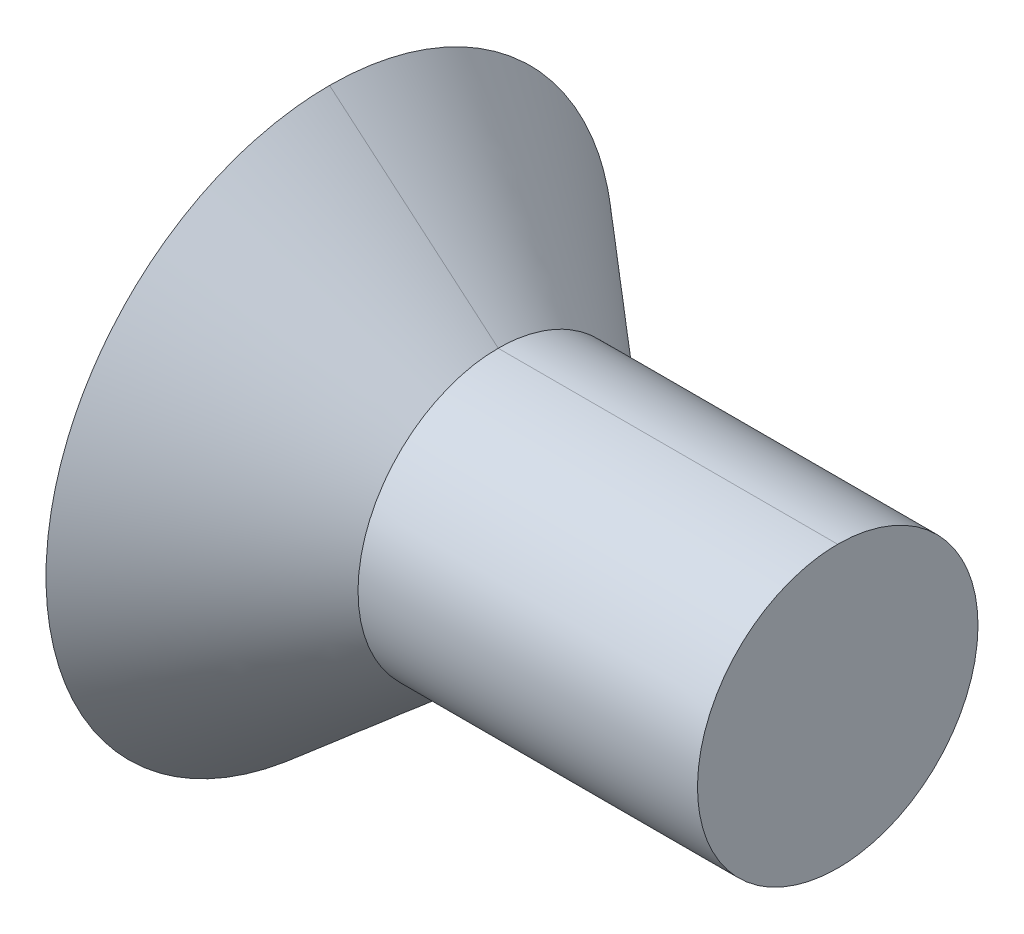
ISO-10303-21;
HEADER;
FILE_DESCRIPTION(('STEP AP214'),'2;1');
FILE_NAME('part.step','',(''),(''),'','','');
FILE_SCHEMA(('AUTOMOTIVE_DESIGN { 1 0 10303 214 1 1 1 1 }'));
ENDSEC;
DATA;
#1=APPLICATION_CONTEXT('core data for automotive mechanical design processes');
#2=APPLICATION_PROTOCOL_DEFINITION('international standard','automotive_design',2000,#1);
#3=PRODUCT_CONTEXT('',#1,'mechanical');
#4=PRODUCT('Part','Part','',(#3));
#5=PRODUCT_RELATED_PRODUCT_CATEGORY('part','',(#4));
#6=PRODUCT_DEFINITION_FORMATION('','',#4);
#7=PRODUCT_DEFINITION_CONTEXT('part definition',#1,'design');
#8=PRODUCT_DEFINITION('design','',#6,#7);
#9=PRODUCT_DEFINITION_SHAPE('','',#8);
#10=(LENGTH_UNIT() NAMED_UNIT(*) SI_UNIT(.MILLI.,.METRE.));
#11=(NAMED_UNIT(*) PLANE_ANGLE_UNIT() SI_UNIT($,.RADIAN.));
#12=(NAMED_UNIT(*) SI_UNIT($,.STERADIAN.) SOLID_ANGLE_UNIT());
#13=UNCERTAINTY_MEASURE_WITH_UNIT(LENGTH_MEASURE(1.E-05),#10,'distance_accuracy_value','');
#14=(GEOMETRIC_REPRESENTATION_CONTEXT(3) GLOBAL_UNCERTAINTY_ASSIGNED_CONTEXT((#13)) GLOBAL_UNIT_ASSIGNED_CONTEXT((#10,
#11,#12)) REPRESENTATION_CONTEXT('',''));
#15=CARTESIAN_POINT('',(0.,0.,0.));
#16=DIRECTION('',(0.,0.,1.));
#17=DIRECTION('',(1.,0.,0.));
#18=AXIS2_PLACEMENT_3D('',#15,#16,#17);
#19=CARTESIAN_POINT('',(0.635,14.4526,34.47415));
#20=CARTESIAN_POINT('',(0.635,14.4539081064262,34.2901004562126));
#21=CARTESIAN_POINT('',(0.635,14.393858912631,33.9238295495636));
#22=CARTESIAN_POINT('',(0.635,14.1415615489514,33.4268467862032));
#23=CARTESIAN_POINT('',(0.635,13.7471939976576,33.0327687066444));
#24=CARTESIAN_POINT('',(0.635,13.2505770594482,32.7796792811504));
#25=CARTESIAN_POINT('',(0.635,12.6999968705676,32.692484266031));
#26=CARTESIAN_POINT('',(0.635,12.1494354583068,32.7796836547764));
#27=CARTESIAN_POINT('',(0.635,11.6527621901618,33.0327512120896));
#28=CARTESIAN_POINT('',(0.635,11.2586011819906,33.426912390771));
#29=CARTESIAN_POINT('',(0.635,11.0055339757836,33.9235846257926));
#30=CARTESIAN_POINT('',(0.635,10.9474000000004,34.290628208596));
#31=CARTESIAN_POINT('',(0.635,10.9473999999998,34.4741499999957));
#32=(BOUNDED_CURVE() B_SPLINE_CURVE(3,(#19,#20,#21,#22,#23,#24,#25,#26,#27,#28,#29,#30,#31),
.UNSPECIFIED.,.F.,.F.) B_SPLINE_CURVE_WITH_KNOTS((4,1,1,1,1,1,1,1,1,1,4),(0.,0.02158795617555,
0.0431759123511,0.06476386852666,0.08635182470221,0.107939780878,0.129527737053,0.151115693229,
0.172703649404,0.19429160558,0.215879561756),
.UNSPECIFIED.) CURVE() GEOMETRIC_REPRESENTATION_ITEM() RATIONAL_B_SPLINE_CURVE((1.,1.,1.,1.,1.,
1.,1.,1.,1.,1.,1.,1.,1.)) REPRESENTATION_ITEM(''));
#33=DIRECTION('',(-1.,0.,0.));
#34=VECTOR('',#33,1.);
#35=SURFACE_OF_LINEAR_EXTRUSION('',#32,#34);
#36=DIRECTION('',(-1.,0.,0.));
#37=VECTOR('',#36,1.);
#38=CARTESIAN_POINT('',(0.635,14.4526,34.47415));
#39=LINE('',#38,#37);
#40=CARTESIAN_POINT('',(4.8768,14.4526,34.47415));
#41=VERTEX_POINT('',#40);
#42=CARTESIAN_POINT('',(0.635,14.4526000000001,34.47415));
#43=VERTEX_POINT('',#42);
#44=EDGE_CURVE('E11',#41,#43,#39,.T.);
#45=ORIENTED_EDGE('',*,*,#44,.F.);
#46=CARTESIAN_POINT('',(4.8768,14.4526,34.47415));
#47=CARTESIAN_POINT('',(4.8768,14.4539081064262,34.2901004562126));
#48=CARTESIAN_POINT('',(4.8768,14.393858912631,33.9238295495636));
#49=CARTESIAN_POINT('',(4.8768,14.1415615489514,33.4268467862032));
#50=CARTESIAN_POINT('',(4.8768,13.7471939976576,33.0327687066444));
#51=CARTESIAN_POINT('',(4.8768,13.2505770594482,32.7796792811504));
#52=CARTESIAN_POINT('',(4.8768,12.6999968705676,32.692484266031));
#53=CARTESIAN_POINT('',(4.8768,12.1494354583068,32.7796836547764));
#54=CARTESIAN_POINT('',(4.8768,11.6527621901618,33.0327512120896));
#55=CARTESIAN_POINT('',(4.8768,11.2586011819906,33.426912390771));
#56=CARTESIAN_POINT('',(4.8768,11.0055339757836,33.9235846257926));
#57=CARTESIAN_POINT('',(4.8768,10.9474000000004,34.290628208596));
#58=CARTESIAN_POINT('',(4.8768,10.9473999999998,34.4741499999957));
#59=(BOUNDED_CURVE() B_SPLINE_CURVE(3,(#46,#47,#48,#49,#50,#51,#52,#53,#54,#55,#56,#57,#58),
.UNSPECIFIED.,.F.,.F.) B_SPLINE_CURVE_WITH_KNOTS((4,1,1,1,1,1,1,1,1,1,4),(0.,0.02158795617555,
0.0431759123511,0.06476386852666,0.08635182470221,0.107939780878,0.129527737053,0.151115693229,
0.172703649404,0.19429160558,0.215879561756),
.UNSPECIFIED.) CURVE() GEOMETRIC_REPRESENTATION_ITEM() RATIONAL_B_SPLINE_CURVE((1.,1.,1.,1.,1.,
1.,1.,1.,1.,1.,1.,1.,1.)) REPRESENTATION_ITEM(''));
#60=CARTESIAN_POINT('',(4.8768,10.9473999999998,34.4741499999957));
#61=VERTEX_POINT('',#60);
#62=EDGE_CURVE('E55',#41,#61,#59,.T.);
#63=ORIENTED_EDGE('',*,*,#62,.T.);
#64=DIRECTION('',(-1.,0.,0.));
#65=VECTOR('',#64,1.);
#66=CARTESIAN_POINT('',(0.635,10.9473999999998,34.4741499999957));
#67=LINE('',#66,#65);
#68=CARTESIAN_POINT('',(0.635,10.9473999999999,34.47415));
#69=VERTEX_POINT('',#68);
#70=EDGE_CURVE('E28',#61,#69,#67,.T.);
#71=ORIENTED_EDGE('',*,*,#70,.T.);
#72=CARTESIAN_POINT('',(0.635,14.4526000000001,34.47415));
#73=CARTESIAN_POINT('',(0.634998647830204,14.4526011485306,34.4757123912241));
#74=CARTESIAN_POINT('',(0.634977245608798,14.4526172208479,34.4772747803708));
#75=CARTESIAN_POINT('',(0.634945375153514,14.4526358662417,34.4803997018677));
#76=CARTESIAN_POINT('',(0.634934907697919,14.4526384383575,34.4819622342202));
#77=CARTESIAN_POINT('',(0.634901211683683,14.452641786966,34.4866498783637));
#78=CARTESIAN_POINT('',(0.634875689664852,14.4526381955611,34.489775001444));
#79=CARTESIAN_POINT('',(0.634803255192437,14.4525986704447,34.4991501378361));
#80=CARTESIAN_POINT('',(0.634760472900199,14.4525339870384,34.5054000682475));
#81=CARTESIAN_POINT('',(0.634678782802885,14.4523341390989,34.5178983861451));
#82=CARTESIAN_POINT('',(0.634639874732716,14.4521989793918,34.5241467737078));
#83=CARTESIAN_POINT('',(0.634567603176656,14.4518568704601,34.5366418188381));
#84=CARTESIAN_POINT('',(0.634534239896032,14.4516499185786,34.5428884763333));
#85=CARTESIAN_POINT('',(0.634441514235924,14.4509224514359,34.5616221469399));
#86=CARTESIAN_POINT('',(0.634389500424585,14.4502952862276,34.5741052551934));
#87=CARTESIAN_POINT('',(0.634303795558303,14.4487585228089,34.5990550581616));
#88=CARTESIAN_POINT('',(0.634270106408036,14.4478488952545,34.6115217510358));
#89=CARTESIAN_POINT('',(0.634193796670611,14.4447003844373,34.6488826443787));
#90=CARTESIAN_POINT('',(0.634175909436104,14.4420416688969,34.6737428711197));
#91=CARTESIAN_POINT('',(0.634190911815507,14.43562483336,34.7233249652448));
#92=CARTESIAN_POINT('',(0.634223812167846,14.4318664809945,34.7480468022588));
#93=CARTESIAN_POINT('',(0.634323257295269,14.4232658843549,34.7973390527865));
#94=CARTESIAN_POINT('',(0.634389851359575,14.4184220579827,34.821909190934));
#95=CARTESIAN_POINT('',(0.634539899592496,14.4076770479317,34.8708125214083));
#96=CARTESIAN_POINT('',(0.634623352076071,14.4017759699344,34.8951457371616));
#97=CARTESIAN_POINT('',(0.634864334479259,14.3825154069536,34.9677519550048));
#98=CARTESIAN_POINT('',(0.635012453277397,14.3676002813175,35.0156219182782));
#99=CARTESIAN_POINT('',(0.63519223427017,14.3338000330269,35.1099187316894));
#100=CARTESIAN_POINT('',(0.635223922461297,14.3149157975864,35.1563459016767));
#101=CARTESIAN_POINT('',(0.635228920001261,14.2733056468743,35.2474362349603));
#102=CARTESIAN_POINT('',(0.635202241733574,14.2505805474537,35.292099770396));
#103=CARTESIAN_POINT('',(0.635125249266712,14.2014264836002,35.3793318548969));
#104=CARTESIAN_POINT('',(0.635074938979293,14.174998132666,35.4219007493956));
#105=CARTESIAN_POINT('',(0.634997393710663,14.1185568389753,35.5045969335802));
#106=CARTESIAN_POINT('',(0.634970159851766,14.088543721956,35.5447241044259));
#107=CARTESIAN_POINT('',(0.634942006202945,14.0255152584444,35.6218207303083));
#108=CARTESIAN_POINT('',(0.634940804442855,13.9925359722908,35.6588196932168));
#109=CARTESIAN_POINT('',(0.634949400013176,13.9235723974578,35.7299009786003));
#110=CARTESIAN_POINT('',(0.634959197283253,13.8875881252625,35.7639833170727));
#111=CARTESIAN_POINT('',(0.634980358106872,13.8128680364238,35.8289860611818));
#112=CARTESIAN_POINT('',(0.634991721649842,13.7741322383534,35.8599064881584));
#113=CARTESIAN_POINT('',(0.635006795753664,13.6941676879951,35.9183352942962));
#114=CARTESIAN_POINT('',(0.635010506333035,13.6529389417403,35.9458436817143));
#115=CARTESIAN_POINT('',(0.635013394019774,13.568549307143,35.9971326430109));
#116=CARTESIAN_POINT('',(0.635012596998174,13.5254008522375,36.0209336862895));
#117=CARTESIAN_POINT('',(0.635009254885298,13.4372645946276,36.0648396357587));
#118=CARTESIAN_POINT('',(0.635006709822723,13.3922768221349,36.0849446026295));
#119=CARTESIAN_POINT('',(0.635002190848982,13.3007612942232,36.1212934539121));
#120=CARTESIAN_POINT('',(0.635000216937016,13.2542335409639,36.1375373437386));
#121=CARTESIAN_POINT('',(0.634997881267378,13.1599866423265,36.1660208356458));
#122=CARTESIAN_POINT('',(0.634997519545037,13.1122674708626,36.1782603499687));
#123=CARTESIAN_POINT('',(0.634997322174616,12.9677091343895,36.2089237289228));
#124=CARTESIAN_POINT('',(0.634998374579792,12.869478662649,36.2212886714747));
#125=CARTESIAN_POINT('',(0.634999814114831,12.7217749341022,36.2273087676636));
#126=CARTESIAN_POINT('',(0.63500027095252,12.6724587684592,36.2272247641043));
#127=CARTESIAN_POINT('',(0.635001168703106,12.5740050471306,36.222889638541));
#128=CARTESIAN_POINT('',(0.635001609615444,12.5248674977756,36.2186383702539));
#129=CARTESIAN_POINT('',(0.635002826641443,12.3782653046964,36.1997229167135));
#130=CARTESIAN_POINT('',(0.635003498033661,12.2815207226066,36.1789005602413));
#131=CARTESIAN_POINT('',(0.634998130429053,12.0929861180148,36.1212292903012));
#132=CARTESIAN_POINT('',(0.634992091391097,12.0011961258843,36.0843802786034));
#133=CARTESIAN_POINT('',(0.634985647225908,11.8250409249626,35.9958615669373));
#134=CARTESIAN_POINT('',(0.634985242577232,11.740676347455,35.944190608445));
#135=CARTESIAN_POINT('',(0.635017997859462,11.5818894457312,35.8273505354968));
#136=CARTESIAN_POINT('',(0.635051154922981,11.5074662727736,35.7621825745525));
#137=CARTESIAN_POINT('',(0.635059313133957,11.3705716917983,35.6203549308651));
#138=CARTESIAN_POINT('',(0.635034325348289,11.3080980118487,35.5436974375558));
#139=CARTESIAN_POINT('',(0.634891424341065,11.1969391993865,35.3808476408653));
#140=CARTESIAN_POINT('',(0.634773465963777,11.1482607828448,35.2946507216857));
#141=CARTESIAN_POINT('',(0.634773306896559,11.0865534113033,35.1602442404775));
#142=CARTESIAN_POINT('',(0.634802816352793,11.0678583800978,35.1145496474626));
#143=CARTESIAN_POINT('',(0.634973524002973,11.0344044831243,35.0217206868342));
#144=CARTESIAN_POINT('',(0.635114733197984,11.0196460052504,34.974586177846));
#145=CARTESIAN_POINT('',(0.635426332230445,10.9941960257318,34.8793417687315));
#146=CARTESIAN_POINT('',(0.635596661710093,10.9834962563405,34.8312340640429));
#147=CARTESIAN_POINT('',(0.63581272707368,10.966167557854,34.7343089674397));
#148=CARTESIAN_POINT('',(0.635858524744146,10.9595366112753,34.685491939548));
#149=CARTESIAN_POINT('',(0.635733626678408,10.9524503135333,34.6095111336219));
#150=CARTESIAN_POINT('',(0.63565096259215,10.9505588519208,34.5824740736502));
#151=CARTESIAN_POINT('',(0.635464877453356,10.9486650189674,34.5418762130295));
#152=CARTESIAN_POINT('',(0.635392502531931,10.9481909679316,34.5283367609741));
#153=CARTESIAN_POINT('',(0.635255105009229,10.9477165821011,34.5080211318033));
#154=CARTESIAN_POINT('',(0.635204493797782,10.9475979019173,34.5012475362047));
#155=CARTESIAN_POINT('',(0.635137982097379,10.9474791823671,34.4910863321458));
#156=CARTESIAN_POINT('',(0.635117378636844,10.947449492637,34.487699040982));
#157=CARTESIAN_POINT('',(0.63504770091951,10.9474099018676,34.480924499457));
#158=CARTESIAN_POINT('',(0.634998627860969,10.9473999999955,34.4775372491));
#159=CARTESIAN_POINT('',(0.635001245435019,10.9474000000037,34.471075529932));
#160=CARTESIAN_POINT('',(0.635044049966237,10.9474081576332,34.4680010608996));
#161=CARTESIAN_POINT('',(0.635106201307541,10.9474407755638,34.461852080648));
#162=CARTESIAN_POINT('',(0.635125547237534,10.9474652364766,34.4587775694315));
#163=CARTESIAN_POINT('',(0.635187467834021,10.9475630562206,34.4495540790546));
#164=CARTESIAN_POINT('',(0.635233924319912,10.947660852056,34.4434053394331));
#165=CARTESIAN_POINT('',(0.635361218169616,10.9480518424998,34.4249604388873));
#166=CARTESIAN_POINT('',(0.635429974512835,10.9484426400273,34.4126661650048));
#167=CARTESIAN_POINT('',(0.635551253361179,10.9494837147075,34.3880868228996));
#168=CARTESIAN_POINT('',(0.635603773576996,10.9501340284227,34.3758017562183));
#169=CARTESIAN_POINT('',(0.635690245300269,10.9516932264456,34.3512483714529));
#170=CARTESIAN_POINT('',(0.635724197108335,10.9526021065668,34.3389800531007));
#171=CARTESIAN_POINT('',(0.635802139278746,10.9557164086863,34.3021956441281));
#172=CARTESIAN_POINT('',(0.635822164605234,10.9583090255318,34.2777111006504));
#173=CARTESIAN_POINT('',(0.635812119869229,10.964519065994,34.228874198912));
#174=CARTESIAN_POINT('',(0.635782051528988,10.9681364543747,34.2045218361357));
#175=CARTESIAN_POINT('',(0.635688229900749,10.9763983021726,34.1559389277787));
#176=CARTESIAN_POINT('',(0.635624406308978,10.9810448933795,34.1317087433933));
#177=CARTESIAN_POINT('',(0.635479193921296,10.991352796458,34.0834668569421));
#178=CARTESIAN_POINT('',(0.635397805002457,10.997014115431,34.0594551564066));
#179=CARTESIAN_POINT('',(0.635159369540537,11.0155120293541,33.9878208657407));
#180=CARTESIAN_POINT('',(0.635007985727527,11.0298658442176,33.9405798743949));
#181=CARTESIAN_POINT('',(0.634819487431246,11.062514285911,33.8475346730425));
#182=CARTESIAN_POINT('',(0.634782270602417,11.0808053674046,33.8017292126357));
#183=CARTESIAN_POINT('',(0.634767564862208,11.1211677328061,33.7118118890514));
#184=CARTESIAN_POINT('',(0.634790080214216,11.1432392864403,33.6677001469912));
#185=CARTESIAN_POINT('',(0.634861684166555,11.1909955299956,33.5815020350176));
#186=CARTESIAN_POINT('',(0.634910758860541,11.2166783238844,33.5394146177237));
#187=CARTESIAN_POINT('',(0.634990418073728,11.2714990913491,33.4575777236255));
#188=CARTESIAN_POINT('',(0.635021003340592,11.3006369251554,33.4178281523436));
#189=CARTESIAN_POINT('',(0.635073321390486,11.3929506608794,33.3024815780204));
#190=CARTESIAN_POINT('',(0.635055739658761,11.4610693961461,33.230709954503));
#191=CARTESIAN_POINT('',(0.635023894276423,11.5713904626161,33.132433774834));
#192=CARTESIAN_POINT('',(0.635012359900441,11.6095423675241,33.1012253745149));
#193=CARTESIAN_POINT('',(0.634995947823556,11.6883695841661,33.0421446014249));
#194=CARTESIAN_POINT('',(0.634991070032477,11.7290448617089,33.0142721834672));
#195=CARTESIAN_POINT('',(0.634986592657636,11.8126006842347,32.9620515746871));
#196=CARTESIAN_POINT('',(0.634986993971428,11.855481602987,32.9377039838683));
#197=CARTESIAN_POINT('',(0.634989810889867,11.9431340369456,32.8926870105669));
#198=CARTESIAN_POINT('',(0.634992226500805,11.9879055580573,32.8720176395745));
#199=CARTESIAN_POINT('',(0.634996845432421,12.079030514135,32.8345197739432));
#200=CARTESIAN_POINT('',(0.634999048751249,12.1253839628796,32.8176913127685));
#201=CARTESIAN_POINT('',(0.635001788677269,12.2193520853508,32.788029117786));
#202=CARTESIAN_POINT('',(0.635002325271793,12.2669667686616,32.7751954143437));
#203=CARTESIAN_POINT('',(0.635002660432274,12.3631126870405,32.7535715153516));
#204=CARTESIAN_POINT('',(0.635002458879718,12.4116440680452,32.7447819693693));
#205=CARTESIAN_POINT('',(0.635001794500805,12.5092714762475,32.7313020949805));
#206=CARTESIAN_POINT('',(0.635001331679049,12.558367493485,32.7266116943769));
#207=CARTESIAN_POINT('',(0.635000401718501,12.6567833972582,32.72139464682));
#208=CARTESIAN_POINT('',(0.634999934579848,12.7061032765347,32.7208678658012));
#209=CARTESIAN_POINT('',(0.634999028158868,12.8045969817254,32.7239919488449));
#210=CARTESIAN_POINT('',(0.634998588877304,12.8537708036077,32.727642927182));
#211=CARTESIAN_POINT('',(0.634997271588534,13.0005719260658,32.7447648908078));
#212=CARTESIAN_POINT('',(0.634996393428812,13.0975592489786,32.7644008328756));
#213=CARTESIAN_POINT('',(0.635001046432603,13.2867851781244,32.8197596847957));
#214=CARTESIAN_POINT('',(0.635006578407099,13.3790231819527,32.8554846298072));
#215=CARTESIAN_POINT('',(0.635014187654277,13.5562482104215,32.9418436923235));
#216=CARTESIAN_POINT('',(0.635016264883614,13.6412351440705,32.9924779968859));
#217=CARTESIAN_POINT('',(0.634986820028034,13.8014286763592,33.1073260194038));
#218=CARTESIAN_POINT('',(0.634955310375733,13.8766388824216,33.1715347055774));
#219=CARTESIAN_POINT('',(0.634938215707811,14.0152758291076,33.3116516786299));
#220=CARTESIAN_POINT('',(0.63495264680963,14.0786984260117,33.3875640626391));
#221=CARTESIAN_POINT('',(0.635088497624349,14.1918081928493,33.5491825655317));
#222=CARTESIAN_POINT('',(0.635210027852696,14.2414811049036,33.6348987213842));
#223=CARTESIAN_POINT('',(0.635233575815951,14.3048090224289,33.7685947546268));
#224=CARTESIAN_POINT('',(0.635214957936428,14.3240560492103,33.8140182869817));
#225=CARTESIAN_POINT('',(0.63507253644871,14.3587301320535,33.9063226031081));
#226=CARTESIAN_POINT('',(0.634948721705494,14.3741567835076,33.9532035406388));
#227=CARTESIAN_POINT('',(0.634647330147329,14.4009944122102,34.0479649269358));
#228=CARTESIAN_POINT('',(0.634469893443226,14.4124156892131,34.0958424716519));
#229=CARTESIAN_POINT('',(0.634221749977029,14.4311204665626,34.1923880454989));
#230=CARTESIAN_POINT('',(0.63415098735865,14.4384061311362,34.2410556474394));
#231=CARTESIAN_POINT('',(0.634208244318208,14.4451503702047,34.3052263153184));
#232=CARTESIAN_POINT('',(0.63423309210184,14.4465474146932,34.3205417641842));
#233=CARTESIAN_POINT('',(0.634308203235675,14.4489167644309,34.3512019607713));
#234=CARTESIAN_POINT('',(0.634358459330168,14.4498891907881,34.366546698883));
#235=CARTESIAN_POINT('',(0.63448955137352,14.4514037042767,34.3972609560739));
#236=CARTESIAN_POINT('',(0.634570394740854,14.4519456869116,34.4126304802634));
#237=CARTESIAN_POINT('',(0.634711142745853,14.4524373452192,34.4356935676659));
#238=CARTESIAN_POINT('',(0.634761315948971,14.4525476702608,34.4433840199335));
#239=CARTESIAN_POINT('',(0.634848843685057,14.4526263294359,34.4549206343055));
#240=CARTESIAN_POINT('',(0.634880066331678,14.4526380759999,34.4587665425152));
#241=CARTESIAN_POINT('',(0.634919965721929,14.4526424592971,34.4645354447192));
#242=CARTESIAN_POINT('',(0.634932109875762,14.4526417142026,34.4664584454449));
#243=CARTESIAN_POINT('',(0.634972959544703,14.4526197772252,34.4703042984945));
#244=CARTESIAN_POINT('',(0.635001664127744,14.452598586493,34.4722271508206));
#245=CARTESIAN_POINT('',(0.635,14.4526000000001,34.47415));
#246=B_SPLINE_CURVE_WITH_KNOTS('',3,(#72,#73,#74,#75,#76,#77,#78,#79,#80,#81,#82,#83,#84,#85,
#86,#87,#88,#89,#90,#91,#92,#93,#94,#95,#96,#97,#98,#99,#100,#101,#102,#103,#104,#105,#106,#107,
#108,#109,#110,#111,#112,#113,#114,#115,#116,#117,#118,#119,#120,#121,#122,#123,#124,#125,#126,
#127,#128,#129,#130,#131,#132,#133,#134,#135,#136,#137,#138,#139,#140,#141,#142,#143,#144,#145,
#146,#147,#148,#149,#150,#151,#152,#153,#154,#155,#156,#157,#158,#159,#160,#161,#162,#163,#164,
#165,#166,#167,#168,#169,#170,#171,#172,#173,#174,#175,#176,#177,#178,#179,#180,#181,#182,#183,
#184,#185,#186,#187,#188,#189,#190,#191,#192,#193,#194,#195,#196,#197,#198,#199,#200,#201,#202,
#203,#204,#205,#206,#207,#208,#209,#210,#211,#212,#213,#214,#215,#216,#217,#218,#219,#220,#221,
#222,#223,#224,#225,#226,#227,#228,#229,#230,#231,#232,#233,#234,#235,#236,#237,#238,#239,#240,
#241,#242,#243,#244,#245),.UNSPECIFIED.,.T.,.F.,(4,2,2,2,2,2,2,2,2,2,2,2,2,2,2,2,2,2,2,2,2,2,2,
2,2,2,2,2,2,2,2,2,2,2,2,2,2,2,2,2,2,2,2,2,2,2,2,2,2,2,2,2,2,2,2,2,2,2,2,2,2,2,2,2,2,2,2,2,2,2,2,
2,2,2,2,2,2,2,2,2,2,2,2,2,2,2,4),(0.,0.00468742034509819,0.00937517429531692,0.0187507895899623,
0.0375015703343468,0.0562510671784269,0.0750012579719993,0.112494449072151,0.149991536491542,
0.224970078740305,0.299964476475844,0.375068899169675,0.450165818704046,0.600388831183891,
0.750578300005404,0.900735906570091,1.05086866663771,1.20100872793833,1.34952170411841,
1.49803386567002,1.6465450248424,1.79505582462417,1.942715126201,2.0903720033713,
2.23802867346577,2.3856885793109,2.68103871890549,2.82884475996259,2.97665598963038,
3.27201046978105,3.56736676023457,3.86274813667246,4.15810427896304,4.45340420986996,
4.7488476561367,4.89681845531075,5.04480382962303,5.19248611212624,5.34009510860124,
5.42137802834149,5.46201820996676,5.48234216407103,5.49250466931063,5.50266674685097,
5.51189045680079,5.52111451278547,5.53956321354101,5.57646232092864,5.61336662875051,
5.65027033910027,5.72411076673136,5.79794865573156,5.87194093978992,5.94593374168633,
6.09386106948761,6.24165574829282,6.3894609762355,6.53718888884086,6.6849108273254,
6.98009452317081,7.12783376225145,7.27557099993629,7.42333335627194,7.57109617418353,
7.71886027943735,7.86662550787033,8.0144144618915,8.16220081289747,8.30998240527634,
8.45776804004143,8.7531008892191,9.0484711066699,9.34384503008726,9.63910965501996,
9.93447787935117,10.2301512511256,10.3780160098444,10.5258964219038,10.6733937244316,
10.8208137681161,10.8669472591594,10.9130675835509,10.9591991008997,10.9822725948422,
10.9938106263059,10.9995798020999,11.0053486532206),.UNSPECIFIED.);
#247=EDGE_CURVE('E53',#69,#43,#246,.T.);
#248=ORIENTED_EDGE('',*,*,#247,.T.);
#249=EDGE_LOOP('',(#45,#63,#71,#248));
#250=FACE_BOUND('',#249,.T.);
#251=ADVANCED_FACE('F17',(#250),#35,.T.);
#252=CARTESIAN_POINT('',(0.656082,14.4346930000001,34.4741499999993));
#253=CARTESIAN_POINT('',(0.635,14.4526000000001,34.4741499999993));
#254=CARTESIAN_POINT('',(-1.4732,16.2433000000002,34.4741499999986));
#255=CARTESIAN_POINT('',(0.656082,14.4346930000002,34.6557966774442));
#256=CARTESIAN_POINT('',(0.635,14.4526000000002,34.6576717913998));
#257=CARTESIAN_POINT('',(-1.4732,16.2433000000004,34.8451831869616));
#258=CARTESIAN_POINT('',(0.656082,14.377153001797,35.0190900323367));
#259=CARTESIAN_POINT('',(0.635,14.3944660242184,35.0247153742036));
#260=CARTESIAN_POINT('',(-1.4732,16.1257682663568,35.5872495608932));
#261=CARTESIAN_POINT('',(0.656082,14.1266714822604,35.5106875727868));
#262=CARTESIAN_POINT('',(0.635,14.1413988180094,35.521387609229));
#263=CARTESIAN_POINT('',(-1.4732,15.6141323929072,36.591391253444));
#264=CARTESIAN_POINT('',(0.656082,13.7365377713465,35.9008214524688));
#265=CARTESIAN_POINT('',(0.635,13.7472378098382,35.9155487879104));
#266=CARTESIAN_POINT('',(-1.4732,14.8172416590058,37.3882823320742));
#267=CARTESIAN_POINT('',(0.656082,13.2449392083323,36.1513033195226));
#268=CARTESIAN_POINT('',(0.635,13.2505645416932,36.1686163452236));
#269=CARTESIAN_POINT('',(-1.4732,13.8130978777876,37.8999189153268));
#270=CARTESIAN_POINT('',(0.656082,12.7000030974576,36.2376117579912));
#271=CARTESIAN_POINT('',(0.635,12.7000031294324,36.255815733969));
#272=CARTESIAN_POINT('',(-1.4732,12.7000063269114,38.0762133317492));
#273=CARTESIAN_POINT('',(0.656082,12.1550484018116,36.1513076484613));
#274=CARTESIAN_POINT('',(0.635,12.1494229405518,36.1686207188496));
#275=CARTESIAN_POINT('',(-1.4732,11.5868768145668,37.8999277576764));
#276=CARTESIAN_POINT('',(0.656082,11.6635055931878,35.9008041366629));
#277=CARTESIAN_POINT('',(0.635,11.6528060023424,35.9155312933556));
#278=CARTESIAN_POINT('',(-1.4732,10.5828469178046,37.388246962625));
#279=CARTESIAN_POINT('',(0.656082,11.2731674494834,35.5107525070469));
#280=CARTESIAN_POINT('',(0.635,11.2584384510486,35.5214532137968));
#281=CARTESIAN_POINT('',(-1.4732,9.785538607573,36.5915238887896));
#282=CARTESIAN_POINT('',(0.656082,11.0234479066936,35.0188476110514));
#283=CARTESIAN_POINT('',(0.635,11.006141087369,35.0244704504364));
#284=CARTESIAN_POINT('',(-1.4732,9.275459154912,35.5867543889346));
#285=CARTESIAN_POINT('',(0.656082,10.9640122590088,34.6563190375789));
#286=CARTESIAN_POINT('',(0.635,10.9460918935738,34.6581995437874));
#287=CARTESIAN_POINT('',(-1.4732,9.1540553500696,34.8462501646374));
#288=CARTESIAN_POINT('',(0.656082,10.965307,34.47415));
#289=CARTESIAN_POINT('',(0.635,10.9474,34.47415));
#290=CARTESIAN_POINT('',(-1.4732,9.1567,34.47415));
#291=B_SPLINE_SURFACE_WITH_KNOTS('',3,1,((#252,#253,#254),(#255,#256,#257),(#258,#259,#260),
(#261,#262,#263),(#264,#265,#266),(#267,#268,#269),(#270,#271,#272),(#273,#274,#275),(#276,#277,
#278),(#279,#280,#281),(#282,#283,#284),(#285,#286,#287),(#288,#289,#290)),.UNSPECIFIED.,.F.,
.F.,.F.,(4,1,1,1,1,1,1,1,1,1,4),(2,1,2),(0.436452157462,0.480097373208,0.523742588955,
0.567387804701,0.611033020447,0.654678236193,0.69832345194,0.741968667686,0.785613883432,
0.829259099178,0.872904314924),(-0.01,0.,1.),.UNSPECIFIED.);
#292=CARTESIAN_POINT('',(0.656082,10.965307,34.47415));
#293=CARTESIAN_POINT('',(0.635,10.9474,34.47415));
#294=CARTESIAN_POINT('',(-1.4732,9.1567,34.47415));
#295=B_SPLINE_CURVE_WITH_KNOTS('',1,(#292,#293,#294),.UNSPECIFIED.,.F.,.F.,(2,1,2),(-0.01,0.,
1.),.UNSPECIFIED.);
#296=CARTESIAN_POINT('',(-1.4732,9.1567,34.47415));
#297=VERTEX_POINT('',#296);
#298=EDGE_CURVE('E56',#69,#297,#295,.T.);
#299=EDGE_CURVE('E62',#43,#69,#246,.T.);
#300=CARTESIAN_POINT('',(0.656082,14.4346930000001,34.4741499999993));
#301=CARTESIAN_POINT('',(0.635,14.4526000000001,34.4741499999993));
#302=CARTESIAN_POINT('',(-1.4732,16.2433000000002,34.4741499999986));
#303=B_SPLINE_CURVE_WITH_KNOTS('',1,(#300,#301,#302),.UNSPECIFIED.,.F.,.F.,(2,1,2),(-0.01,0.,
1.),.UNSPECIFIED.);
#304=CARTESIAN_POINT('',(-1.4732,16.2433000000002,34.4741499999986));
#305=VERTEX_POINT('',#304);
#306=EDGE_CURVE('E68',#43,#305,#303,.T.);
#307=CARTESIAN_POINT('',(-1.4732,9.1567,34.47415));
#308=CARTESIAN_POINT('',(-1.4732,9.15669833452269,34.4773133918135));
#309=CARTESIAN_POINT('',(-1.4732,9.15666532033868,34.4804767808251));
#310=CARTESIAN_POINT('',(-1.4732,9.15662723490452,34.4868036748352));
#311=CARTESIAN_POINT('',(-1.4732,9.15662216417774,34.4899671798347));
#312=CARTESIAN_POINT('',(-1.4732,9.15661565572512,34.499457630449));
#313=CARTESIAN_POINT('',(-1.4732,9.1566229213815,34.5057845910246));
#314=CARTESIAN_POINT('',(-1.4732,9.15670311620701,34.5247647006678));
#315=CARTESIAN_POINT('',(-1.4732,9.15683443861625,34.5374176488585));
#316=CARTESIAN_POINT('',(-1.4732,9.15723987457418,34.5627197739938));
#317=CARTESIAN_POINT('',(-1.4732,9.15751397192335,34.5753689512033));
#318=CARTESIAN_POINT('',(-1.4732,9.15820770720488,34.6006638606087));
#319=CARTESIAN_POINT('',(-1.4732,9.15862735200993,34.6133095926137));
#320=CARTESIAN_POINT('',(-1.4732,9.1601023300227,34.6512326177683));
#321=CARTESIAN_POINT('',(-1.4732,9.16137380596824,34.6765019077781));
#322=CARTESIAN_POINT('',(-1.4732,9.16448917048393,34.7270069326211));
#323=CARTESIAN_POINT('',(-1.4732,9.16633311601949,34.7522426638637));
#324=CARTESIAN_POINT('',(-1.4732,9.17271478880208,34.8278629917503));
#325=CARTESIAN_POINT('',(-1.4732,9.17810305196954,34.8781785576951));
#326=CARTESIAN_POINT('',(-1.4732,9.19110691888808,34.9785281171007));
#327=CARTESIAN_POINT('',(-1.4732,9.19872295233474,35.028562054341));
#328=CARTESIAN_POINT('',(-1.4732,9.2161466727718,35.1282983205252));
#329=CARTESIAN_POINT('',(-1.4732,9.22595649385534,35.1780002777057));
#330=CARTESIAN_POINT('',(-1.4732,9.24771633196863,35.2769249001441));
#331=CARTESIAN_POINT('',(-1.4732,9.259666164487,35.3261476063373));
#332=CARTESIAN_POINT('',(-1.4732,9.29866706579348,35.4730165222709));
#333=CARTESIAN_POINT('',(-1.4732,9.32886647307695,35.5698461046646));
#334=CARTESIAN_POINT('',(-1.4732,9.39731088866647,35.7606120475656));
#335=CARTESIAN_POINT('',(-1.4732,9.4355566791752,35.8545481257719));
#336=CARTESIAN_POINT('',(-1.4732,9.51982873225326,36.0388459091868));
#337=CARTESIAN_POINT('',(-1.4732,9.56585346280404,36.1292083138945));
#338=CARTESIAN_POINT('',(-1.4732,9.66540502324168,36.3056885504237));
#339=CARTESIAN_POINT('',(-1.4732,9.71893082099796,36.3918069640093));
#340=CARTESIAN_POINT('',(-1.4732,9.83324095099858,36.5590928519387));
#341=CARTESIAN_POINT('',(-1.4732,9.89402557995366,36.6402601236956));
#342=CARTESIAN_POINT('',(-1.4732,10.0216113500985,36.7961222204378));
#343=CARTESIAN_POINT('',(-1.4732,10.0883331929674,36.8708820205494));
#344=CARTESIAN_POINT('',(-1.4732,10.2278484667208,37.0145015302077));
#345=CARTESIAN_POINT('',(-1.4732,10.3006418745549,37.0833612621516));
#346=CARTESIAN_POINT('',(-1.4732,10.4517894266673,37.2146858435327));
#347=CARTESIAN_POINT('',(-1.4732,10.5301436569618,37.2771505940142));
#348=CARTESIAN_POINT('',(-1.4732,10.6918882114032,37.3951783932472));
#349=CARTESIAN_POINT('',(-1.4732,10.7752785219329,37.4507414606591));
#350=CARTESIAN_POINT('',(-1.4732,10.9459604302848,37.5543290400876));
#351=CARTESIAN_POINT('',(-1.4732,11.0332269550607,37.6023948963361));
#352=CARTESIAN_POINT('',(-1.4732,11.211476916013,37.6910515801849));
#353=CARTESIAN_POINT('',(-1.4732,11.3024602901728,37.7316425324435));
#354=CARTESIAN_POINT('',(-1.4732,11.4875245664443,37.805013479936));
#355=CARTESIAN_POINT('',(-1.4732,11.5816054219799,37.8377935925585));
#356=CARTESIAN_POINT('',(-1.4732,11.772208403914,37.895261631407));
#357=CARTESIAN_POINT('',(-1.4732,11.8687305847844,37.9199493769008));
#358=CARTESIAN_POINT('',(-1.4732,12.0635997528775,37.9611628350271));
#359=CARTESIAN_POINT('',(-1.4732,12.1619484528235,37.9776804391988));
#360=CARTESIAN_POINT('',(-1.4732,12.3596833884785,38.002408982225));
#361=CARTESIAN_POINT('',(-1.4732,12.4590695954563,38.0106201504922));
#362=CARTESIAN_POINT('',(-1.4732,12.6581842735426,38.0186023325644));
#363=CARTESIAN_POINT('',(-1.4732,12.7579127513185,38.0183731810094));
#364=CARTESIAN_POINT('',(-1.4732,12.9569932390807,38.0094824326676));
#365=CARTESIAN_POINT('',(-1.4732,13.0563452355828,38.0008205366582));
#366=CARTESIAN_POINT('',(-1.4732,13.2539783325531,37.9751926082585));
#367=CARTESIAN_POINT('',(-1.4732,13.3522594278835,37.958226536045));
#368=CARTESIAN_POINT('',(-1.4732,13.5470244352573,37.9161153133447));
#369=CARTESIAN_POINT('',(-1.4732,13.6435084220307,37.8909705037649));
#370=CARTESIAN_POINT('',(-1.4732,13.929205448581,37.8033677056453));
#371=CARTESIAN_POINT('',(-1.4732,14.114837606365,37.7287188541145));
#372=CARTESIAN_POINT('',(-1.4732,14.4709202413777,37.5495289616597));
#373=CARTESIAN_POINT('',(-1.4732,14.6413700310514,37.4449865678658));
#374=CARTESIAN_POINT('',(-1.4732,14.962262223641,37.2085178597304));
#375=CARTESIAN_POINT('',(-1.4732,15.1127045957338,37.0765915032024));
#376=CARTESIAN_POINT('',(-1.4732,15.320141210485,36.8614537478749));
#377=CARTESIAN_POINT('',(-1.4732,15.3862751679011,36.7868281259171));
#378=CARTESIAN_POINT('',(-1.4732,15.5120236754524,36.6322388374024));
#379=CARTESIAN_POINT('',(-1.4732,15.5716384925242,36.5522753896275));
#380=CARTESIAN_POINT('',(-1.4732,15.683870618003,36.3875910117571));
#381=CARTESIAN_POINT('',(-1.4732,15.7364879605085,36.3028701048475));
#382=CARTESIAN_POINT('',(-1.4732,15.8344311928657,36.129309592139));
#383=CARTESIAN_POINT('',(-1.4732,15.8797568297513,36.0404698435857));
#384=CARTESIAN_POINT('',(-1.4732,15.9627937608937,35.8593018660638));
#385=CARTESIAN_POINT('',(-1.4732,16.0005052680306,35.766973734711));
#386=CARTESIAN_POINT('',(-1.4732,16.0679688145134,35.5794553038779));
#387=CARTESIAN_POINT('',(-1.4732,16.0977210659541,35.4842650807406));
#388=CARTESIAN_POINT('',(-1.4732,16.149078270652,35.2917143829698));
#389=CARTESIAN_POINT('',(-1.4732,16.1706832853209,35.1943539247007));
#390=CARTESIAN_POINT('',(-1.4732,16.2056546066599,34.9981637481375));
#391=CARTESIAN_POINT('',(-1.4732,16.2190207715583,34.8993340045903));
#392=CARTESIAN_POINT('',(-1.4732,16.2374006210726,34.7009050885156));
#393=CARTESIAN_POINT('',(-1.4732,16.2424148612703,34.601305967611));
#394=CARTESIAN_POINT('',(-1.4732,16.2439696302103,34.4020420056445));
#395=CARTESIAN_POINT('',(-1.4732,16.2405102188798,34.3023771650523));
#396=CARTESIAN_POINT('',(-1.4732,16.2252149585701,34.1036956765227));
#397=CARTESIAN_POINT('',(-1.4732,16.213379188518,34.0046790224866));
#398=CARTESIAN_POINT('',(-1.4732,16.1814493258015,33.8079864574945));
#399=CARTESIAN_POINT('',(-1.4732,16.1613552627472,33.7103105417328));
#400=CARTESIAN_POINT('',(-1.4732,16.1130101184538,33.5170072293019));
#401=CARTESIAN_POINT('',(-1.4732,16.0847598942515,33.4213796185336));
#402=CARTESIAN_POINT('',(-1.4732,16.0202472199059,33.2328654966177));
#403=CARTESIAN_POINT('',(-1.4732,15.9839846590093,33.1399790233806));
#404=CARTESIAN_POINT('',(-1.4732,15.9037901494148,32.9575815494842));
#405=CARTESIAN_POINT('',(-1.4732,15.8598582667533,32.8680705197688));
#406=CARTESIAN_POINT('',(-1.4732,15.7646450249174,32.693047709558));
#407=CARTESIAN_POINT('',(-1.4732,15.713363839907,32.6075358343541));
#408=CARTESIAN_POINT('',(-1.4732,15.6037622211789,32.4411645349068));
#409=CARTESIAN_POINT('',(-1.4732,15.5454428031787,32.3603044418261));
#410=CARTESIAN_POINT('',(-1.4732,15.4221699817495,32.2038078045877));
#411=CARTESIAN_POINT('',(-1.4732,15.3572163657057,32.1281714279717));
#412=CARTESIAN_POINT('',(-1.4732,15.2211973678516,31.9826125740273));
#413=CARTESIAN_POINT('',(-1.4732,15.1501320322791,31.912690053479));
#414=CARTESIAN_POINT('',(-1.4732,15.002387873065,31.7790564796044));
#415=CARTESIAN_POINT('',(-1.4732,14.9257092693149,31.7153451831902));
#416=CARTESIAN_POINT('',(-1.4732,14.7672340460047,31.5946611871814));
#417=CARTESIAN_POINT('',(-1.4732,14.6854383854103,31.5376872307205));
#418=CARTESIAN_POINT('',(-1.4732,14.5173575144471,31.4308469358156));
#419=CARTESIAN_POINT('',(-1.4732,14.4310721092519,31.3809809061622));
#420=CARTESIAN_POINT('',(-1.4732,14.1664276838343,31.2425196442134));
#421=CARTESIAN_POINT('',(-1.4732,13.9821345370421,31.164950608245));
#422=CARTESIAN_POINT('',(-1.4732,13.6031294450775,31.0420942654735));
#423=CARTESIAN_POINT('',(-1.4732,13.4084197522229,30.996800010143));
#424=CARTESIAN_POINT('',(-1.4732,13.112940569131,30.9536696035798));
#425=CARTESIAN_POINT('',(-1.4732,13.0138339629149,30.9434289279946));
#426=CARTESIAN_POINT('',(-1.4732,12.8150842192928,30.9313354730874));
#427=CARTESIAN_POINT('',(-1.4732,12.7154410935253,30.9294825125396));
#428=CARTESIAN_POINT('',(-1.4732,12.5163640273306,30.9342272684571));
#429=CARTESIAN_POINT('',(-1.4732,12.4169300870044,30.9408249889984));
#430=CARTESIAN_POINT('',(-1.4732,12.2189620962008,30.9623360688139));
#431=CARTESIAN_POINT('',(-1.4732,12.1204280819144,30.9772497610355));
#432=CARTESIAN_POINT('',(-1.4732,11.924947756365,31.0152860887116));
#433=CARTESIAN_POINT('',(-1.4732,11.8280015749603,31.0384093921043));
#434=CARTESIAN_POINT('',(-1.4732,11.6364181318775,31.092776681369));
#435=CARTESIAN_POINT('',(-1.4732,11.541780735126,31.1240201909239));
#436=CARTESIAN_POINT('',(-1.4732,11.3554904781465,31.1943907954872));
#437=CARTESIAN_POINT('',(-1.4732,11.2638374900773,31.2335175522884));
#438=CARTESIAN_POINT('',(-1.4732,11.0841209502111,31.3193158825594));
#439=CARTESIAN_POINT('',(-1.4732,10.9960578590846,31.3659884205426));
#440=CARTESIAN_POINT('',(-1.4732,10.8241379918679,31.4665654458957));
#441=CARTESIAN_POINT('',(-1.4732,10.7402820224546,31.5204713129641));
#442=CARTESIAN_POINT('',(-1.4732,10.577469137706,31.6351696773282));
#443=CARTESIAN_POINT('',(-1.4732,10.4985102981371,31.6959594428531));
#444=CARTESIAN_POINT('',(-1.4732,10.3458767771005,31.8240637670612));
#445=CARTESIAN_POINT('',(-1.4732,10.2722101652605,31.8913879367866));
#446=CARTESIAN_POINT('',(-1.4732,10.1308649782584,32.0319203561595));
#447=CARTESIAN_POINT('',(-1.4732,10.0631805974603,32.1051227664015));
#448=CARTESIAN_POINT('',(-1.4732,9.93417767412987,32.2570614037911));
#449=CARTESIAN_POINT('',(-1.4732,9.87286526197049,32.3358028400581));
#450=CARTESIAN_POINT('',(-1.4732,9.75718115681642,32.4982533330925));
#451=CARTESIAN_POINT('',(-1.4732,9.70281096360402,32.5819634575823));
#452=CARTESIAN_POINT('',(-1.4732,9.60145950475629,32.7533524176093));
#453=CARTESIAN_POINT('',(-1.4732,9.55445367821033,32.841016748464));
#454=CARTESIAN_POINT('',(-1.4732,9.46786374654199,33.0199410495265));
#455=CARTESIAN_POINT('',(-1.4732,9.42827991687306,33.1112011530326));
#456=CARTESIAN_POINT('',(-1.4732,9.35683865393152,33.2965290231823));
#457=CARTESIAN_POINT('',(-1.4732,9.32496917695127,33.3905921524374));
#458=CARTESIAN_POINT('',(-1.4732,9.26916835263054,33.5810364728399));
#459=CARTESIAN_POINT('',(-1.4732,9.24523511120639,33.677417104988));
#460=CARTESIAN_POINT('',(-1.4732,9.21374071462994,33.832129638422));
#461=CARTESIAN_POINT('',(-1.4732,9.20348496783871,33.8899261626303));
#462=CARTESIAN_POINT('',(-1.4732,9.1859430399103,34.0059520765582));
#463=CARTESIAN_POINT('',(-1.4732,9.17865566833216,34.0641812831956));
#464=CARTESIAN_POINT('',(-1.4732,9.16999912910202,34.1517508572003));
#465=CARTESIAN_POINT('',(-1.4732,9.16749247052429,34.1809833139049));
#466=CARTESIAN_POINT('',(-1.4732,9.1632448870507,34.2395015872173));
#467=CARTESIAN_POINT('',(-1.4732,9.16150388292815,34.2687873979892));
#468=CARTESIAN_POINT('',(-1.4732,9.1587974088817,34.3274093558091));
#469=CARTESIAN_POINT('',(-1.4732,9.15783232014519,34.3567455205113));
#470=CARTESIAN_POINT('',(-1.4732,9.15696376888248,34.4007630408647));
#471=CARTESIAN_POINT('',(-1.4732,9.15677077437986,34.4154391186471));
#472=CARTESIAN_POINT('',(-1.4732,9.15663801153958,34.4374546444206));
#473=CARTESIAN_POINT('',(-1.4732,9.15661988088738,34.4447936488577));
#474=CARTESIAN_POINT('',(-1.4732,9.15661612313707,34.4558022562227));
#475=CARTESIAN_POINT('',(-1.4732,9.15661877715521,34.4594718675783));
#476=CARTESIAN_POINT('',(-1.4732,9.15666168174566,34.4668109872122));
#477=CARTESIAN_POINT('',(-1.4732,9.15670193193789,34.4704804954911));
#478=CARTESIAN_POINT('',(-1.4732,9.1567,34.47415));
#479=B_SPLINE_CURVE_WITH_KNOTS('',3,(#307,#308,#309,#310,#311,#312,#313,#314,#315,#316,#317,
#318,#319,#320,#321,#322,#323,#324,#325,#326,#327,#328,#329,#330,#331,#332,#333,#334,#335,#336,
#337,#338,#339,#340,#341,#342,#343,#344,#345,#346,#347,#348,#349,#350,#351,#352,#353,#354,#355,
#356,#357,#358,#359,#360,#361,#362,#363,#364,#365,#366,#367,#368,#369,#370,#371,#372,#373,#374,
#375,#376,#377,#378,#379,#380,#381,#382,#383,#384,#385,#386,#387,#388,#389,#390,#391,#392,#393,
#394,#395,#396,#397,#398,#399,#400,#401,#402,#403,#404,#405,#406,#407,#408,#409,#410,#411,#412,
#413,#414,#415,#416,#417,#418,#419,#420,#421,#422,#423,#424,#425,#426,#427,#428,#429,#430,#431,
#432,#433,#434,#435,#436,#437,#438,#439,#440,#441,#442,#443,#444,#445,#446,#447,#448,#449,#450,
#451,#452,#453,#454,#455,#456,#457,#458,#459,#460,#461,#462,#463,#464,#465,#466,#467,#468,#469,
#470,#471,#472,#473,#474,#475,#476,#477,#478),.UNSPECIFIED.,.T.,.F.,(4,2,2,2,2,2,2,2,2,2,2,2,2,
2,2,2,2,2,2,2,2,2,2,2,2,2,2,2,2,2,2,2,2,2,2,2,2,2,2,2,2,2,2,2,2,2,2,2,2,2,2,2,2,2,2,2,2,2,2,2,2,
2,2,2,2,2,2,2,2,2,2,2,2,2,2,2,2,2,2,2,2,2,2,2,2,4),(0.,0.00949035025975185,0.0189808782699674,
0.037961696254421,0.0759216186628462,0.113877235000084,0.151834643822818,0.227730960163184,
0.3036348312315,0.455389075384241,0.607172609438821,0.75910444418838,0.911023185704604,
1.2149135701937,1.51883351004838,1.82269366417534,2.12651204878145,2.43034285646968,
2.73059499324602,3.03084599018587,3.3311016324999,3.63135646298428,3.92989202499135,
4.22842260789579,4.52694870392174,4.82548146667866,5.12430991691648,5.42313011368221,
5.72195616483462,6.02079281974013,6.31963090774962,6.61845654114833,7.21558806619706,
7.81274661946162,8.40990609268793,8.7087611270656,9.00760391976899,9.30644525617165,
9.60529695784042,9.90414030289086,10.2029756837001,10.501808811928,10.8006470822478,
11.0994654726339,11.3982817497305,11.6970952112432,11.9959076013684,12.294688604167,
12.5934737372229,12.8922562977228,13.1910317788354,13.489764193826,13.7885061856892,
14.0872459176413,14.3859739531585,14.6846461720692,14.9833313622829,15.5801592619095,
16.1768586299438,16.4754716743252,16.7740782668094,17.0726850033208,17.3713036960393,
17.6699466900942,17.968572170224,18.2671848414393,18.5658357120017,18.8645436289755,
19.1631334209085,19.4621692441424,19.7609115972789,20.0599387557121,20.3590304064285,
20.6571022871703,20.9551852281009,21.2527997539461,21.5503431990868,21.7263764914099,
21.9023391174462,21.9903502551827,22.0783522837548,22.1663975191011,22.2104282869989,
22.2324452368244,22.2434540644326,22.2544627807479),.UNSPECIFIED.);
#480=EDGE_CURVE('E64',#297,#305,#479,.T.);
#481=ORIENTED_EDGE('',*,*,#298,.F.);
#482=ORIENTED_EDGE('',*,*,#299,.F.);
#483=ORIENTED_EDGE('',*,*,#306,.T.);
#484=ORIENTED_EDGE('',*,*,#480,.F.);
#485=EDGE_LOOP('',(#481,#482,#483,#484));
#486=FACE_BOUND('',#485,.T.);
#487=ADVANCED_FACE('F61',(#486),#291,.F.);
#488=CARTESIAN_POINT('',(-1.4732,9.1567,34.47415));
#489=DIRECTION('',(-1.,0.,0.));
#490=DIRECTION('',(0.,0.,1.));
#491=AXIS2_PLACEMENT_3D('',#488,#489,#490);
#492=PLANE('',#491);
#493=ORIENTED_EDGE('',*,*,#480,.T.);
#494=EDGE_CURVE('E140',#305,#297,#479,.T.);
#495=ORIENTED_EDGE('',*,*,#494,.T.);
#496=EDGE_LOOP('',(#493,#495));
#497=FACE_BOUND('',#496,.T.);
#498=ADVANCED_FACE('F95',(#497),#492,.T.);
#499=CARTESIAN_POINT('',(4.8768,12.6988432985542,34.47415));
#500=DIRECTION('',(1.,0.,0.));
#501=DIRECTION('',(0.,0.,-1.));
#502=AXIS2_PLACEMENT_3D('',#499,#500,#501);
#503=PLANE('',#502);
#504=ORIENTED_EDGE('',*,*,#62,.F.);
#505=CARTESIAN_POINT('',(4.8768,10.9473999999998,34.4741499999957));
#506=CARTESIAN_POINT('',(4.8768,10.9473999999991,34.6576717913955));
#507=CARTESIAN_POINT('',(4.8768,11.0055339757796,35.0247153741998));
#508=CARTESIAN_POINT('',(4.8768,11.2586011819906,35.521387609229));
#509=CARTESIAN_POINT('',(4.8768,11.6527621901618,35.9155487879104));
#510=CARTESIAN_POINT('',(4.8768,12.1494354583068,36.1686163452236));
#511=CARTESIAN_POINT('',(4.8768,12.6999968705676,36.255815733969));
#512=CARTESIAN_POINT('',(4.8768,13.2505770594482,36.1686207188496));
#513=CARTESIAN_POINT('',(4.8768,13.7471939976576,35.9155312933556));
#514=CARTESIAN_POINT('',(4.8768,14.1415615489514,35.5214532137968));
#515=CARTESIAN_POINT('',(4.8768,14.393858912631,35.0244704504364));
#516=CARTESIAN_POINT('',(4.8768,14.4539081064262,34.6581995437874));
#517=CARTESIAN_POINT('',(4.8768,14.4526,34.47415));
#518=(BOUNDED_CURVE() B_SPLINE_CURVE(3,(#505,#506,#507,#508,#509,#510,#511,#512,#513,#514,#515,
#516,#517),.UNSPECIFIED.,.F.,.F.) B_SPLINE_CURVE_WITH_KNOTS((4,1,1,1,1,1,1,1,1,1,4),
(0.215879561756,0.237467517931,0.259055474107,0.280643430282,0.302231386458,0.323819342633,
0.345407298809,0.366995254984,0.38858321116,0.410171167335,0.431759123511),
.UNSPECIFIED.) CURVE() GEOMETRIC_REPRESENTATION_ITEM() RATIONAL_B_SPLINE_CURVE((1.,1.,1.,1.,1.,
1.,1.,1.,1.,1.,1.,1.,1.)) REPRESENTATION_ITEM(''));
#519=EDGE_CURVE('E21',#61,#41,#518,.T.);
#520=ORIENTED_EDGE('',*,*,#519,.F.);
#521=EDGE_LOOP('',(#504,#520));
#522=FACE_BOUND('',#521,.T.);
#523=ADVANCED_FACE('F107',(#522),#503,.T.);
#524=CARTESIAN_POINT('',(0.656082,10.965307,34.47415));
#525=CARTESIAN_POINT('',(0.635,10.9474,34.47415));
#526=CARTESIAN_POINT('',(-1.4732,9.1567,34.47415));
#527=CARTESIAN_POINT('',(0.656082,10.9640122590088,34.2919809624211));
#528=CARTESIAN_POINT('',(0.635,10.9460918935738,34.2901004562126));
#529=CARTESIAN_POINT('',(-1.4732,9.1540553500696,34.1020498353626));
#530=CARTESIAN_POINT('',(0.656082,11.0234479066936,33.9294523889486));
#531=CARTESIAN_POINT('',(0.635,11.006141087369,33.9238295495636));
#532=CARTESIAN_POINT('',(-1.4732,9.275459154912,33.3615456110654));
#533=CARTESIAN_POINT('',(0.656082,11.2731674494834,33.4375474929531));
#534=CARTESIAN_POINT('',(0.635,11.2584384510486,33.4268467862032));
#535=CARTESIAN_POINT('',(-1.4732,9.785538607573,32.3567761112104));
#536=CARTESIAN_POINT('',(0.656082,11.6635055931878,33.0474958633371));
#537=CARTESIAN_POINT('',(0.635,11.6528060023424,33.0327687066444));
#538=CARTESIAN_POINT('',(-1.4732,10.5828469178046,31.560053037375));
#539=CARTESIAN_POINT('',(0.656082,12.1550484018116,32.7969923515387));
#540=CARTESIAN_POINT('',(0.635,12.1494229405518,32.7796792811504));
#541=CARTESIAN_POINT('',(-1.4732,11.5868768145668,31.0483722423236));
#542=CARTESIAN_POINT('',(0.656082,12.7000030974576,32.7106882420088));
#543=CARTESIAN_POINT('',(0.635,12.7000031294324,32.692484266031));
#544=CARTESIAN_POINT('',(-1.4732,12.7000063269114,30.8720866682508));
#545=CARTESIAN_POINT('',(0.656082,13.2449392083323,32.7969966804774));
#546=CARTESIAN_POINT('',(0.635,13.2505645416932,32.7796836547764));
#547=CARTESIAN_POINT('',(-1.4732,13.8130978777876,31.0483810846732));
#548=CARTESIAN_POINT('',(0.656082,13.7365377713465,33.0474785475312));
#549=CARTESIAN_POINT('',(0.635,13.7472378098382,33.0327512120896));
#550=CARTESIAN_POINT('',(-1.4732,14.8172416590058,31.5600176679258));
#551=CARTESIAN_POINT('',(0.656082,14.1266714822604,33.4376124272132));
#552=CARTESIAN_POINT('',(0.635,14.1413988180094,33.426912390771));
#553=CARTESIAN_POINT('',(-1.4732,15.6141323929072,32.356908746556));
#554=CARTESIAN_POINT('',(0.656082,14.377153001797,33.9292099676633));
#555=CARTESIAN_POINT('',(0.635,14.3944660242184,33.9235846257964));
#556=CARTESIAN_POINT('',(-1.4732,16.1257682663568,33.3610504391068));
#557=CARTESIAN_POINT('',(0.656082,14.434693,34.2925033225544));
#558=CARTESIAN_POINT('',(0.635,14.4526,34.2906282085988));
#559=CARTESIAN_POINT('',(-1.4732,16.2433,34.1031168130356));
#560=CARTESIAN_POINT('',(0.656082,14.4346930000001,34.4741499999993));
#561=CARTESIAN_POINT('',(0.635,14.4526000000001,34.4741499999993));
#562=CARTESIAN_POINT('',(-1.4732,16.2433000000002,34.4741499999986));
#563=B_SPLINE_SURFACE_WITH_KNOTS('',3,1,((#524,#525,#526),(#527,#528,#529),(#530,#531,#532),
(#533,#534,#535),(#536,#537,#538),(#539,#540,#541),(#542,#543,#544),(#545,#546,#547),(#548,#549,
#550),(#551,#552,#553),(#554,#555,#556),(#557,#558,#559),(#560,#561,#562)),.UNSPECIFIED.,.F.,
.F.,.F.,(4,1,1,1,1,1,1,1,1,1,4),(2,1,2),(0.,0.04364521574622,0.08729043149245,0.130935647239,
0.174580862985,0.218226078731,0.261871294477,0.305516510224,0.34916172597,0.392806941716,
0.436452157462),(-0.01,0.,1.),.UNSPECIFIED.);
#564=ORIENTED_EDGE('',*,*,#247,.F.);
#565=ORIENTED_EDGE('',*,*,#298,.T.);
#566=ORIENTED_EDGE('',*,*,#494,.F.);
#567=ORIENTED_EDGE('',*,*,#306,.F.);
#568=EDGE_LOOP('',(#564,#565,#566,#567));
#569=FACE_BOUND('',#568,.T.);
#570=ADVANCED_FACE('F73',(#569),#563,.F.);
#571=CARTESIAN_POINT('',(0.635,10.9473999999998,34.4741499999957));
#572=CARTESIAN_POINT('',(0.635,10.9473999999991,34.6576717913955));
#573=CARTESIAN_POINT('',(0.635,11.0055339757796,35.0247153741998));
#574=CARTESIAN_POINT('',(0.635,11.2586011819906,35.521387609229));
#575=CARTESIAN_POINT('',(0.635,11.6527621901618,35.9155487879104));
#576=CARTESIAN_POINT('',(0.635,12.1494354583068,36.1686163452236));
#577=CARTESIAN_POINT('',(0.635,12.6999968705676,36.255815733969));
#578=CARTESIAN_POINT('',(0.635,13.2505770594482,36.1686207188496));
#579=CARTESIAN_POINT('',(0.635,13.7471939976576,35.9155312933556));
#580=CARTESIAN_POINT('',(0.635,14.1415615489514,35.5214532137968));
#581=CARTESIAN_POINT('',(0.635,14.393858912631,35.0244704504364));
#582=CARTESIAN_POINT('',(0.635,14.4539081064262,34.6581995437874));
#583=CARTESIAN_POINT('',(0.635,14.4526,34.47415));
#584=(BOUNDED_CURVE() B_SPLINE_CURVE(3,(#571,#572,#573,#574,#575,#576,#577,#578,#579,#580,#581,
#582,#583),.UNSPECIFIED.,.F.,.F.) B_SPLINE_CURVE_WITH_KNOTS((4,1,1,1,1,1,1,1,1,1,4),
(0.215879561756,0.237467517931,0.259055474107,0.280643430282,0.302231386458,0.323819342633,
0.345407298809,0.366995254984,0.38858321116,0.410171167335,0.431759123511),
.UNSPECIFIED.) CURVE() GEOMETRIC_REPRESENTATION_ITEM() RATIONAL_B_SPLINE_CURVE((1.,1.,1.,1.,1.,
1.,1.,1.,1.,1.,1.,1.,1.)) REPRESENTATION_ITEM(''));
#585=DIRECTION('',(-1.,0.,0.));
#586=VECTOR('',#585,1.);
#587=SURFACE_OF_LINEAR_EXTRUSION('',#584,#586);
#588=ORIENTED_EDGE('',*,*,#519,.T.);
#589=ORIENTED_EDGE('',*,*,#44,.T.);
#590=ORIENTED_EDGE('',*,*,#299,.T.);
#591=ORIENTED_EDGE('',*,*,#70,.F.);
#592=EDGE_LOOP('',(#588,#589,#590,#591));
#593=FACE_BOUND('',#592,.T.);
#594=ADVANCED_FACE('F70',(#593),#587,.T.);
#595=CLOSED_SHELL('',(#251,#487,#498,#523,#570,#594));
#596=MANIFOLD_SOLID_BREP('B1',#595);
#597=ADVANCED_BREP_SHAPE_REPRESENTATION('',(#18,#596),#14);
#598=SHAPE_DEFINITION_REPRESENTATION(#9,#597);
ENDSEC;
END-ISO-10303-21;
